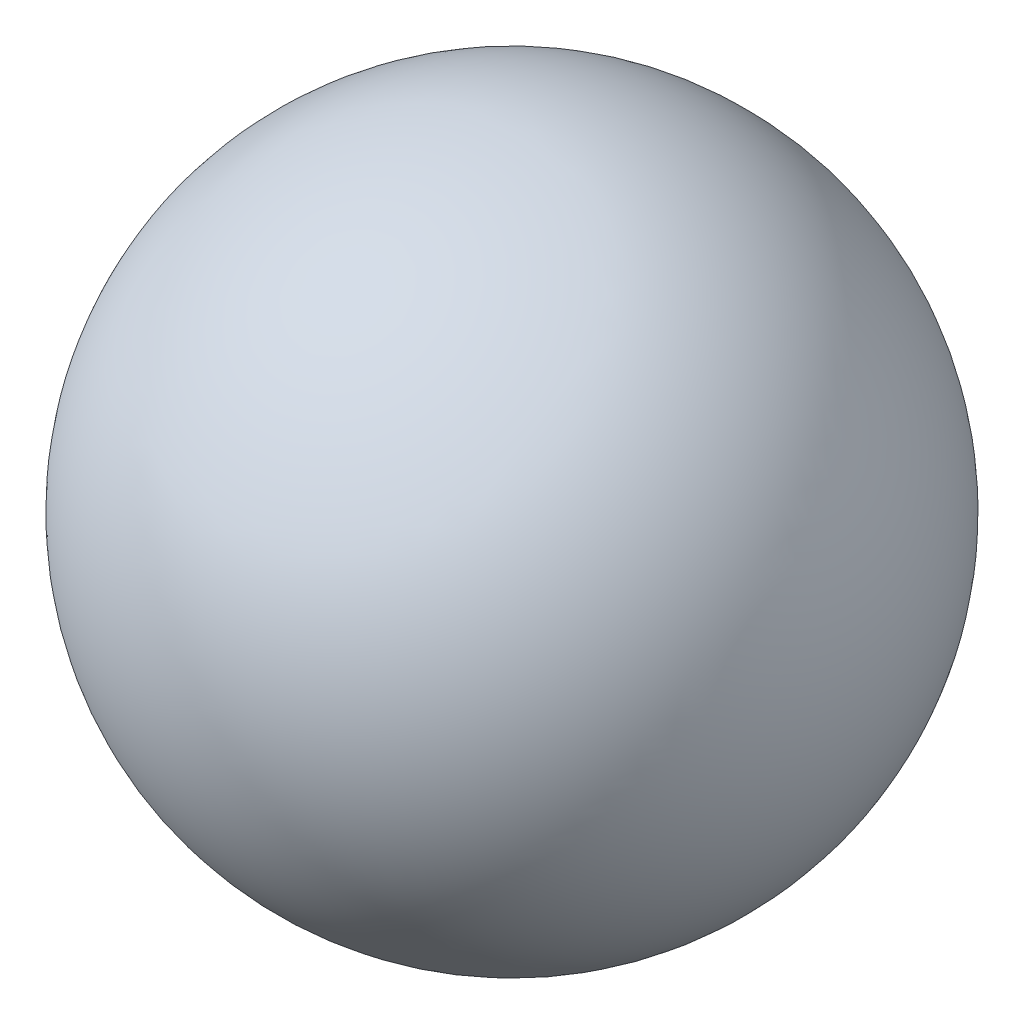
ISO-10303-21;
HEADER;
FILE_DESCRIPTION(('STEP AP214'),'2;1');
FILE_NAME('part.step','',(''),(''),'','','');
FILE_SCHEMA(('AUTOMOTIVE_DESIGN { 1 0 10303 214 1 1 1 1 }'));
ENDSEC;
DATA;
#1=APPLICATION_CONTEXT('core data for automotive mechanical design processes');
#2=APPLICATION_PROTOCOL_DEFINITION('international standard','automotive_design',2000,#1);
#3=PRODUCT_CONTEXT('',#1,'mechanical');
#4=PRODUCT('Part','Part','',(#3));
#5=PRODUCT_RELATED_PRODUCT_CATEGORY('part','',(#4));
#6=PRODUCT_DEFINITION_FORMATION('','',#4);
#7=PRODUCT_DEFINITION_CONTEXT('part definition',#1,'design');
#8=PRODUCT_DEFINITION('design','',#6,#7);
#9=PRODUCT_DEFINITION_SHAPE('','',#8);
#10=(LENGTH_UNIT() NAMED_UNIT(*) SI_UNIT(.MILLI.,.METRE.));
#11=(NAMED_UNIT(*) PLANE_ANGLE_UNIT() SI_UNIT($,.RADIAN.));
#12=(NAMED_UNIT(*) SI_UNIT($,.STERADIAN.) SOLID_ANGLE_UNIT());
#13=UNCERTAINTY_MEASURE_WITH_UNIT(LENGTH_MEASURE(1.E-05),#10,'distance_accuracy_value','');
#14=(GEOMETRIC_REPRESENTATION_CONTEXT(3) GLOBAL_UNCERTAINTY_ASSIGNED_CONTEXT((#13)) GLOBAL_UNIT_ASSIGNED_CONTEXT((#10,
#11,#12)) REPRESENTATION_CONTEXT('',''));
#15=CARTESIAN_POINT('',(0.,0.,0.));
#16=DIRECTION('',(0.,0.,1.));
#17=DIRECTION('',(1.,0.,0.));
#18=AXIS2_PLACEMENT_3D('',#15,#16,#17);
#19=CARTESIAN_POINT('',(120.,0.,0.));
#20=DIRECTION('',(-1.,0.,0.));
#21=DIRECTION('',(0.,1.,0.));
#22=AXIS2_PLACEMENT_3D('',#19,#20,#21);
#23=SPHERICAL_SURFACE('',#22,120.);
#24=CARTESIAN_POINT('',(0.,0.,0.));
#25=VERTEX_POINT('',#24);
#26=VERTEX_LOOP('',#25);
#27=FACE_BOUND('',#26,.T.);
#28=ADVANCED_FACE('F39',(#27),#23,.T.);
#29=CLOSED_SHELL('',(#28));
#30=MANIFOLD_SOLID_BREP('B2',#29);
#31=ADVANCED_BREP_SHAPE_REPRESENTATION('',(#18,#30),#14);
#32=SHAPE_DEFINITION_REPRESENTATION(#9,#31);
ENDSEC;
END-ISO-10303-21;
